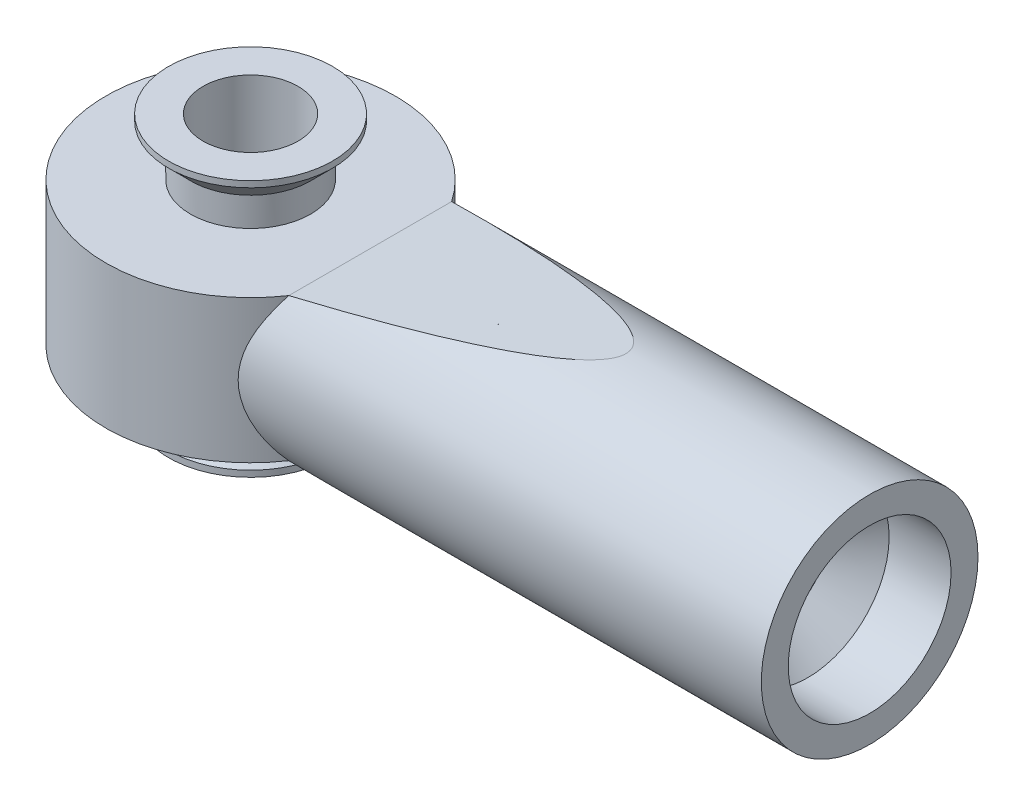
ISO-10303-21;
HEADER;
FILE_DESCRIPTION(('STEP AP214'),'2;1');
FILE_NAME('part.step','',(''),(''),'','','');
FILE_SCHEMA(('AUTOMOTIVE_DESIGN { 1 0 10303 214 1 1 1 1 }'));
ENDSEC;
DATA;
#1=APPLICATION_CONTEXT('core data for automotive mechanical design processes');
#2=APPLICATION_PROTOCOL_DEFINITION('international standard','automotive_design',2000,#1);
#3=PRODUCT_CONTEXT('',#1,'mechanical');
#4=PRODUCT('Part','Part','',(#3));
#5=PRODUCT_RELATED_PRODUCT_CATEGORY('part','',(#4));
#6=PRODUCT_DEFINITION_FORMATION('','',#4);
#7=PRODUCT_DEFINITION_CONTEXT('part definition',#1,'design');
#8=PRODUCT_DEFINITION('design','',#6,#7);
#9=PRODUCT_DEFINITION_SHAPE('','',#8);
#10=(LENGTH_UNIT() NAMED_UNIT(*) SI_UNIT(.MILLI.,.METRE.));
#11=(NAMED_UNIT(*) PLANE_ANGLE_UNIT() SI_UNIT($,.RADIAN.));
#12=(NAMED_UNIT(*) SI_UNIT($,.STERADIAN.) SOLID_ANGLE_UNIT());
#13=UNCERTAINTY_MEASURE_WITH_UNIT(LENGTH_MEASURE(1.E-05),#10,'distance_accuracy_value','');
#14=(GEOMETRIC_REPRESENTATION_CONTEXT(3) GLOBAL_UNCERTAINTY_ASSIGNED_CONTEXT((#13)) GLOBAL_UNIT_ASSIGNED_CONTEXT((#10,
#11,#12)) REPRESENTATION_CONTEXT('',''));
#15=CARTESIAN_POINT('',(0.,0.,0.));
#16=DIRECTION('',(0.,0.,1.));
#17=DIRECTION('',(1.,0.,0.));
#18=AXIS2_PLACEMENT_3D('',#15,#16,#17);
#19=CARTESIAN_POINT('',(17.,0.,0.));
#20=DIRECTION('',(-1.,0.,0.));
#21=DIRECTION('',(0.,0.,1.));
#22=AXIS2_PLACEMENT_3D('',#19,#20,#21);
#23=CYLINDRICAL_SURFACE('',#22,3.5);
#24=CARTESIAN_POINT('',(3.86545275485292,-2.31,2.62942959593901));
#25=CARTESIAN_POINT('',(3.82315125019685,-2.23916639045834,2.69163558248972));
#26=CARTESIAN_POINT('',(3.78060308197022,-2.16591923057143,2.75093631681326));
#27=CARTESIAN_POINT('',(3.69597081213414,-2.01458999035849,2.86362891555874));
#28=CARTESIAN_POINT('',(3.65388736125131,-1.93650194691396,2.91701325706475));
#29=CARTESIAN_POINT('',(3.57069852067631,-1.77458168341613,3.01829294269165));
#30=CARTESIAN_POINT('',(3.52961385522195,-1.69068640601002,3.06610494584605));
#31=CARTESIAN_POINT('',(3.45032221851786,-1.51820866561967,3.15506796810709));
#32=CARTESIAN_POINT('',(3.4121136698583,-1.42962881795746,3.19622265287118));
#33=CARTESIAN_POINT('',(3.32269979003703,-1.2041589793433,3.28956154879868));
#34=CARTESIAN_POINT('',(3.27404228373987,-1.06446261710354,3.33757830087836));
#35=CARTESIAN_POINT('',(3.19211369892511,-0.776372924365029,3.41603748196162));
#36=CARTESIAN_POINT('',(3.15876861079958,-0.62802541758275,3.44656462491423));
#37=CARTESIAN_POINT('',(3.12410092169717,-0.400213578668356,3.47790818529037));
#38=CARTESIAN_POINT('',(3.11509570930935,-0.322844145616872,3.48595240590558));
#39=CARTESIAN_POINT('',(3.1028388679205,-0.167268493420498,3.49686862876157));
#40=CARTESIAN_POINT('',(3.09958697231596,-0.0890623132186827,3.4997408706673));
#41=CARTESIAN_POINT('',(3.0990395309018,0.067370699419271,3.50022552023661));
#42=CARTESIAN_POINT('',(3.10174275105624,0.145597524218554,3.49783901763209));
#43=CARTESIAN_POINT('',(3.11293351633187,0.301281760312659,3.48788205501167));
#44=CARTESIAN_POINT('',(3.12142093600615,0.37873918825709,3.48031170742224));
#45=CARTESIAN_POINT('',(3.15149632426064,0.585480008125305,3.45316764108692));
#46=CARTESIAN_POINT('',(3.17808752206281,0.713453944491327,3.42891053279658));
#47=CARTESIAN_POINT('',(3.24330128453004,0.96336898615014,3.36728439780416));
#48=CARTESIAN_POINT('',(3.28196952599256,1.08528511633356,3.32986552278641));
#49=CARTESIAN_POINT('',(3.36261132369463,1.30806335110264,3.24828728457426));
#50=CARTESIAN_POINT('',(3.40368779105866,1.40973110527985,3.20540497245888));
#51=CARTESIAN_POINT('',(3.49011920634573,1.60723341644409,3.1110754628632));
#52=CARTESIAN_POINT('',(3.53547912891955,1.70306097303739,3.05961825245294));
#53=CARTESIAN_POINT('',(3.62800160636842,1.88761537461664,2.94929551352007));
#54=CARTESIAN_POINT('',(3.67513701943126,1.97641191102892,2.89052323000088));
#55=CARTESIAN_POINT('',(3.7701099515216,2.14780958330742,2.76551755553624));
#56=CARTESIAN_POINT('',(3.81794556868654,2.23042473545763,2.69930195243758));
#57=CARTESIAN_POINT('',(3.86545275485295,2.30999999999999,2.62942959593903));
#58=B_SPLINE_CURVE_WITH_KNOTS('',3,(#24,#25,#26,#27,#28,#29,#30,#31,#32,#33,#34,#35,#36,#37,#38,
#39,#40,#41,#42,#43,#44,#45,#46,#47,#48,#49,#50,#51,#52,#53,#54,#55,#56,#57),.UNSPECIFIED.,.F.,
.F.,(4,2,2,2,2,2,2,2,2,2,2,2,2,2,2,2,4),(0.,0.309920368521231,0.620230397415549,
0.934707669024716,1.24901118914877,1.7139549399129,2.17662718996787,2.41121044490835,
2.64578282918733,2.88030660928519,3.11482530322598,3.51197516996565,3.91064567498154,
4.26328664620656,4.61634232029633,4.96528677463775,5.31341438132882),.UNSPECIFIED.);
#59=CARTESIAN_POINT('',(3.86545275485292,-2.31,2.62942959593901));
#60=VERTEX_POINT('',#59);
#61=CARTESIAN_POINT('',(3.86545275485292,2.31,2.62942959593901));
#62=VERTEX_POINT('',#61);
#63=EDGE_CURVE('E77',#60,#62,#58,.T.);
#64=ORIENTED_EDGE('',*,*,#63,.F.);
#65=CARTESIAN_POINT('',(-12.1677860151385,0.,0.));
#66=DIRECTION('',(0.142603230781916,0.989779934414999,0.));
#67=DIRECTION('',(-0.989779934414999,0.142603230781916,0.));
#68=AXIS2_PLACEMENT_3D('',#65,#66,#67);
#69=ELLIPSE('',#68,24.5436234565581,3.5);
#70=CARTESIAN_POINT('',(3.86545275485292,-2.31,-2.62942959593902));
#71=VERTEX_POINT('',#70);
#72=EDGE_CURVE('E71',#60,#71,#69,.T.);
#73=ORIENTED_EDGE('',*,*,#72,.T.);
#74=CARTESIAN_POINT('',(3.86545275485292,2.31,-2.62942959593901));
#75=CARTESIAN_POINT('',(3.82315125019685,2.23916639045834,-2.69163558248972));
#76=CARTESIAN_POINT('',(3.78060308197022,2.16591923057143,-2.75093631681326));
#77=CARTESIAN_POINT('',(3.69597081213414,2.01458999035849,-2.86362891555874));
#78=CARTESIAN_POINT('',(3.65388736125131,1.93650194691396,-2.91701325706475));
#79=CARTESIAN_POINT('',(3.57069852067631,1.77458168341613,-3.01829294269165));
#80=CARTESIAN_POINT('',(3.52961385522195,1.69068640601002,-3.06610494584605));
#81=CARTESIAN_POINT('',(3.45032221851786,1.51820866561967,-3.15506796810709));
#82=CARTESIAN_POINT('',(3.4121136698583,1.42962881795746,-3.19622265287118));
#83=CARTESIAN_POINT('',(3.32269979003703,1.2041589793433,-3.28956154879868));
#84=CARTESIAN_POINT('',(3.27404228373987,1.06446261710354,-3.33757830087836));
#85=CARTESIAN_POINT('',(3.19211369892511,0.776372924365029,-3.41603748196162));
#86=CARTESIAN_POINT('',(3.15876861079958,0.62802541758275,-3.44656462491423));
#87=CARTESIAN_POINT('',(3.12410092169717,0.400213578668356,-3.47790818529037));
#88=CARTESIAN_POINT('',(3.11509570930935,0.322844145616872,-3.48595240590558));
#89=CARTESIAN_POINT('',(3.1028388679205,0.167268493420498,-3.49686862876157));
#90=CARTESIAN_POINT('',(3.09958697231596,0.0890623132186827,-3.4997408706673));
#91=CARTESIAN_POINT('',(3.0990395309018,-0.067370699419271,-3.50022552023661));
#92=CARTESIAN_POINT('',(3.10174275105624,-0.145597524218554,-3.49783901763209));
#93=CARTESIAN_POINT('',(3.11293351633187,-0.301281760312659,-3.48788205501167));
#94=CARTESIAN_POINT('',(3.12142093600615,-0.37873918825709,-3.48031170742224));
#95=CARTESIAN_POINT('',(3.15149632426064,-0.585480008125305,-3.45316764108692));
#96=CARTESIAN_POINT('',(3.17808752206281,-0.713453944491327,-3.42891053279658));
#97=CARTESIAN_POINT('',(3.24330128453004,-0.96336898615014,-3.36728439780416));
#98=CARTESIAN_POINT('',(3.28196952599256,-1.08528511633356,-3.32986552278641));
#99=CARTESIAN_POINT('',(3.36261132369463,-1.30806335110264,-3.24828728457426));
#100=CARTESIAN_POINT('',(3.40368779105866,-1.40973110527985,-3.20540497245888));
#101=CARTESIAN_POINT('',(3.49011920634573,-1.60723341644409,-3.1110754628632));
#102=CARTESIAN_POINT('',(3.53547912891955,-1.70306097303739,-3.05961825245294));
#103=CARTESIAN_POINT('',(3.62800160636842,-1.88761537461664,-2.94929551352007));
#104=CARTESIAN_POINT('',(3.67513701943126,-1.97641191102892,-2.89052323000088));
#105=CARTESIAN_POINT('',(3.7701099515216,-2.14780958330742,-2.76551755553624));
#106=CARTESIAN_POINT('',(3.81794556868654,-2.23042473545763,-2.69930195243758));
#107=CARTESIAN_POINT('',(3.86545275485295,-2.30999999999999,-2.62942959593903));
#108=B_SPLINE_CURVE_WITH_KNOTS('',3,(#74,#75,#76,#77,#78,#79,#80,#81,#82,#83,#84,#85,#86,#87,
#88,#89,#90,#91,#92,#93,#94,#95,#96,#97,#98,#99,#100,#101,#102,#103,#104,#105,#106,#107),
.UNSPECIFIED.,.F.,.F.,(4,2,2,2,2,2,2,2,2,2,2,2,2,2,2,2,4),(0.,0.309920368521231,
0.620230397415549,0.934707669024716,1.24901118914877,1.7139549399129,2.17662718996787,
2.41121044490835,2.64578282918733,2.88030660928519,3.11482530322598,3.51197516996565,
3.91064567498154,4.26328664620656,4.61634232029633,4.96528677463775,5.31341438132882),.UNSPECIFIED.);
#109=CARTESIAN_POINT('',(3.86545275485292,2.31,-2.62942959593901));
#110=VERTEX_POINT('',#109);
#111=EDGE_CURVE('E75',#110,#71,#108,.T.);
#112=ORIENTED_EDGE('',*,*,#111,.F.);
#113=CARTESIAN_POINT('',(-12.1677860151385,0.,0.));
#114=DIRECTION('',(-0.142603230781916,0.989779934414999,0.));
#115=DIRECTION('',(-0.989779934414999,-0.142603230781916,0.));
#116=AXIS2_PLACEMENT_3D('',#113,#114,#115);
#117=ELLIPSE('',#116,24.5436234565581,3.5);
#118=EDGE_CURVE('E55',#62,#110,#117,.T.);
#119=ORIENTED_EDGE('',*,*,#118,.F.);
#120=EDGE_LOOP('',(#64,#73,#112,#119));
#121=FACE_BOUND('',#120,.T.);
#122=CARTESIAN_POINT('',(20.,0.,0.));
#123=DIRECTION('',(1.,0.,0.));
#124=DIRECTION('',(0.,0.,-1.));
#125=AXIS2_PLACEMENT_3D('',#122,#123,#124);
#126=CIRCLE('',#125,3.5);
#127=CARTESIAN_POINT('',(20.,0.,-3.5));
#128=VERTEX_POINT('',#127);
#129=EDGE_CURVE('E86',#128,#128,#126,.T.);
#130=ORIENTED_EDGE('',*,*,#129,.F.);
#131=EDGE_LOOP('',(#130));
#132=FACE_BOUND('',#131,.T.);
#133=ADVANCED_FACE('F41',(#121,#132),#23,.T.);
#134=CARTESIAN_POINT('',(0.,-2.31,0.));
#135=DIRECTION('',(0.,1.,0.));
#136=DIRECTION('',(0.,0.,1.));
#137=AXIS2_PLACEMENT_3D('',#134,#135,#136);
#138=PLANE('',#137);
#139=CARTESIAN_POINT('',(0.,-2.31,0.));
#140=DIRECTION('',(0.,-1.,0.));
#141=DIRECTION('',(0.,0.,-1.));
#142=AXIS2_PLACEMENT_3D('',#139,#140,#141);
#143=CIRCLE('',#142,1.94);
#144=CARTESIAN_POINT('',(0.,-2.31,-1.94));
#145=VERTEX_POINT('',#144);
#146=EDGE_CURVE('E152',#145,#145,#143,.T.);
#147=ORIENTED_EDGE('',*,*,#146,.F.);
#148=EDGE_LOOP('',(#147));
#149=FACE_BOUND('',#148,.T.);
#150=CARTESIAN_POINT('',(0.,-2.31,0.));
#151=DIRECTION('',(0.,1.,0.));
#152=DIRECTION('',(0.,0.,1.));
#153=AXIS2_PLACEMENT_3D('',#150,#151,#152);
#154=CIRCLE('',#153,4.675);
#155=EDGE_CURVE('E90',#71,#60,#154,.T.);
#156=ORIENTED_EDGE('',*,*,#155,.F.);
#157=DIRECTION('',(0.,0.,-1.));
#158=VECTOR('',#157,1.);
#159=CARTESIAN_POINT('',(3.86545275485292,-2.31,35.1521253581698));
#160=LINE('',#159,#158);
#161=EDGE_CURVE('E80',#60,#71,#160,.T.);
#162=ORIENTED_EDGE('',*,*,#161,.F.);
#163=EDGE_LOOP('',(#156,#162));
#164=FACE_BOUND('',#163,.T.);
#165=ADVANCED_FACE('F93',(#149,#164),#138,.F.);
#166=CARTESIAN_POINT('',(0.,2.31,0.));
#167=DIRECTION('',(0.,1.,0.));
#168=DIRECTION('',(0.,0.,1.));
#169=AXIS2_PLACEMENT_3D('',#166,#167,#168);
#170=PLANE('',#169);
#171=CARTESIAN_POINT('',(0.,2.31,0.));
#172=DIRECTION('',(0.,1.,0.));
#173=DIRECTION('',(0.,0.,1.));
#174=AXIS2_PLACEMENT_3D('',#171,#172,#173);
#175=CIRCLE('',#174,1.94);
#176=CARTESIAN_POINT('',(0.,2.31,1.94));
#177=VERTEX_POINT('',#176);
#178=EDGE_CURVE('E129',#177,#177,#175,.T.);
#179=ORIENTED_EDGE('',*,*,#178,.F.);
#180=EDGE_LOOP('',(#179));
#181=FACE_BOUND('',#180,.T.);
#182=CARTESIAN_POINT('',(0.,2.31,0.));
#183=DIRECTION('',(0.,1.,0.));
#184=DIRECTION('',(0.,0.,1.));
#185=AXIS2_PLACEMENT_3D('',#182,#183,#184);
#186=CIRCLE('',#185,4.675);
#187=EDGE_CURVE('E62',#110,#62,#186,.T.);
#188=ORIENTED_EDGE('',*,*,#187,.T.);
#189=DIRECTION('',(0.,0.,-1.));
#190=VECTOR('',#189,1.);
#191=CARTESIAN_POINT('',(3.86545275485292,2.31,32.7771253581698));
#192=LINE('',#191,#190);
#193=EDGE_CURVE('E79',#62,#110,#192,.T.);
#194=ORIENTED_EDGE('',*,*,#193,.T.);
#195=EDGE_LOOP('',(#188,#194));
#196=FACE_BOUND('',#195,.T.);
#197=ADVANCED_FACE('F144',(#181,#196),#170,.T.);
#198=CARTESIAN_POINT('',(0.,2.31,0.));
#199=DIRECTION('',(0.,-1.,0.));
#200=DIRECTION('',(0.,0.,-1.));
#201=AXIS2_PLACEMENT_3D('',#198,#199,#200);
#202=CYLINDRICAL_SURFACE('',#201,4.675);
#203=ORIENTED_EDGE('',*,*,#187,.F.);
#204=ORIENTED_EDGE('',*,*,#111,.T.);
#205=ORIENTED_EDGE('',*,*,#155,.T.);
#206=ORIENTED_EDGE('',*,*,#63,.T.);
#207=EDGE_LOOP('',(#203,#204,#205,#206));
#208=FACE_BOUND('',#207,.T.);
#209=ADVANCED_FACE('F89',(#208),#202,.T.);
#210=CARTESIAN_POINT('',(3.86545275485292,2.31,32.7771253581698));
#211=DIRECTION('',(-0.142603230781916,0.989779934414999,0.));
#212=DIRECTION('',(-0.989779934414999,-0.142603230781916,0.));
#213=AXIS2_PLACEMENT_3D('',#210,#211,#212);
#214=PLANE('',#213);
#215=ORIENTED_EDGE('',*,*,#193,.F.);
#216=ORIENTED_EDGE('',*,*,#118,.T.);
#217=EDGE_LOOP('',(#215,#216));
#218=FACE_BOUND('',#217,.T.);
#219=ADVANCED_FACE('F184',(#218),#214,.T.);
#220=CARTESIAN_POINT('',(3.86545275485292,-2.31,35.1521253581698));
#221=DIRECTION('',(0.142603230781916,0.989779934414999,0.));
#222=DIRECTION('',(-0.989779934414999,0.142603230781916,0.));
#223=AXIS2_PLACEMENT_3D('',#220,#221,#222);
#224=PLANE('',#223);
#225=ORIENTED_EDGE('',*,*,#72,.F.);
#226=ORIENTED_EDGE('',*,*,#161,.T.);
#227=EDGE_LOOP('',(#225,#226));
#228=FACE_BOUND('',#227,.T.);
#229=ADVANCED_FACE('F83',(#228),#224,.F.);
#230=CARTESIAN_POINT('',(20.,0.,0.));
#231=DIRECTION('',(1.,0.,0.));
#232=DIRECTION('',(0.,0.,-1.));
#233=AXIS2_PLACEMENT_3D('',#230,#231,#232);
#234=PLANE('',#233);
#235=ORIENTED_EDGE('',*,*,#129,.T.);
#236=EDGE_LOOP('',(#235));
#237=FACE_BOUND('',#236,.T.);
#238=CARTESIAN_POINT('',(20.,0.,0.));
#239=DIRECTION('',(1.,0.,0.));
#240=DIRECTION('',(0.,0.,-1.));
#241=AXIS2_PLACEMENT_3D('',#238,#239,#240);
#242=CIRCLE('',#241,2.63);
#243=CARTESIAN_POINT('',(20.,0.,-2.63));
#244=VERTEX_POINT('',#243);
#245=EDGE_CURVE('E179',#244,#244,#242,.T.);
#246=ORIENTED_EDGE('',*,*,#245,.F.);
#247=EDGE_LOOP('',(#246));
#248=FACE_BOUND('',#247,.T.);
#249=ADVANCED_FACE('F191',(#237,#248),#234,.T.);
#250=CARTESIAN_POINT('',(20.,0.,0.));
#251=DIRECTION('',(-1.,0.,0.));
#252=DIRECTION('',(0.,0.,1.));
#253=AXIS2_PLACEMENT_3D('',#250,#251,#252);
#254=CYLINDRICAL_SURFACE('',#253,2.63);
#255=CARTESIAN_POINT('',(18.,0.,0.));
#256=DIRECTION('',(1.,0.,0.));
#257=DIRECTION('',(0.,0.,-1.));
#258=AXIS2_PLACEMENT_3D('',#255,#256,#257);
#259=CIRCLE('',#258,2.63);
#260=CARTESIAN_POINT('',(18.,0.,-2.63));
#261=VERTEX_POINT('',#260);
#262=EDGE_CURVE('E12',#261,#261,#259,.F.);
#263=ORIENTED_EDGE('',*,*,#262,.T.);
#264=EDGE_LOOP('',(#263));
#265=FACE_BOUND('',#264,.T.);
#266=ORIENTED_EDGE('',*,*,#245,.T.);
#267=EDGE_LOOP('',(#266));
#268=FACE_BOUND('',#267,.T.);
#269=ADVANCED_FACE('F117',(#265,#268),#254,.F.);
#270=CARTESIAN_POINT('',(4.39267856779892,0.,1.6));
#271=CARTESIAN_POINT('',(4.39267783068027,0.0869985683872898,1.60000091719905));
#272=CARTESIAN_POINT('',(4.39529134416636,0.173990829474555,1.59288037177048));
#273=CARTESIAN_POINT('',(4.40540493577367,0.345388620748124,1.56468910286211));
#274=CARTESIAN_POINT('',(4.41290560332278,0.429793837631407,1.54361669667704));
#275=CARTESIAN_POINT('',(4.43184653083318,0.593504893035541,1.48835621276796));
#276=CARTESIAN_POINT('',(4.44327872322318,0.672820782534057,1.45419497733885));
#277=CARTESIAN_POINT('',(4.46878259348331,0.824622677538631,1.37381900529423));
#278=CARTESIAN_POINT('',(4.48285490153016,0.89710704619087,1.32760138987668));
#279=CARTESIAN_POINT('',(4.51270466683595,1.03617996677286,1.22238127241968));
#280=CARTESIAN_POINT('',(4.52852626703914,1.10244568563931,1.16296448791584));
#281=CARTESIAN_POINT('',(4.55971983740334,1.22429393392608,1.03391574170305));
#282=CARTESIAN_POINT('',(4.57509173048807,1.27987464100909,0.964282041055312));
#283=CARTESIAN_POINT('',(4.60416775398041,1.38025819578965,0.814397001324495));
#284=CARTESIAN_POINT('',(4.61781395596332,1.42472019845003,0.733905152818253));
#285=CARTESIAN_POINT('',(4.64137880146701,1.4993438421169,0.566036957563993));
#286=CARTESIAN_POINT('',(4.65129850751435,1.52950956003027,0.478662581822227));
#287=CARTESIAN_POINT('',(4.66597987770425,1.57358196541378,0.302896342780723));
#288=CARTESIAN_POINT('',(4.67091669985343,1.58804225212001,0.214658197497899));
#289=CARTESIAN_POINT('',(4.67569921389321,1.60205634153264,0.0368790073134609));
#290=CARTESIAN_POINT('',(4.67554628756981,1.60161419001427,-0.0526616773710911));
#291=CARTESIAN_POINT('',(4.67028375291522,1.58618123278794,-0.22657570800873));
#292=CARTESIAN_POINT('',(4.66537920455921,1.57179229943517,-0.31100969683181));
#293=CARTESIAN_POINT('',(4.65142431547498,1.52987303226937,-0.476182891032238));
#294=CARTESIAN_POINT('',(4.64237369015265,1.5023417963398,-0.556921842357102));
#295=CARTESIAN_POINT('',(4.62088862619212,1.4345832665099,-0.713697118877403));
#296=CARTESIAN_POINT('',(4.60841017362769,1.39418966221873,-0.789655283573059));
#297=CARTESIAN_POINT('',(4.58136105638374,1.30199194469094,-0.933888955856146));
#298=CARTESIAN_POINT('',(4.56678978880269,1.25018454104439,-1.00216223942625));
#299=CARTESIAN_POINT('',(4.53623352034167,1.13362338687979,-1.13266268666825));
#300=CARTESIAN_POINT('',(4.52021424187374,1.06835602022471,-1.19442375060662));
#301=CARTESIAN_POINT('',(4.48916868049016,0.928261278909806,-1.30628002257966));
#302=CARTESIAN_POINT('',(4.47414256868552,0.853432263370069,-1.35637322411099));
#303=CARTESIAN_POINT('',(4.44659093585832,0.69478844099452,-1.44416503299335));
#304=CARTESIAN_POINT('',(4.43410851262751,0.610850701265377,-1.48165606468019));
#305=CARTESIAN_POINT('',(4.41355538544715,0.437317433934365,-1.54180942512934));
#306=CARTESIAN_POINT('',(4.40548271189674,0.347724452208705,-1.56447837502054));
#307=CARTESIAN_POINT('',(4.39511260307666,0.1699592204286,-1.5933725555286));
#308=CARTESIAN_POINT('',(4.39256026037587,0.0819199332680171,-1.60032428518256));
#309=CARTESIAN_POINT('',(4.39280529830769,-0.094085526328023,-1.59965258967879));
#310=CARTESIAN_POINT('',(4.39560163846549,-0.18205170965411,-1.59203199926236));
#311=CARTESIAN_POINT('',(4.4059738139099,-0.352026477148167,-1.56308615667784));
#312=CARTESIAN_POINT('',(4.41336950660047,-0.434135124119997,-1.542276901823));
#313=CARTESIAN_POINT('',(4.43190570175925,-0.593674929363688,-1.4881696816339));
#314=CARTESIAN_POINT('',(4.44304689038041,-0.67110522752103,-1.4548694278922));
#315=CARTESIAN_POINT('',(4.46827339283942,-0.821923753511974,-1.37547899426323));
#316=CARTESIAN_POINT('',(4.48244372251818,-0.895094302658536,-1.32900304693133));
#317=CARTESIAN_POINT('',(4.51197160385328,-1.03285981212858,-1.2250120144863));
#318=CARTESIAN_POINT('',(4.52732952267414,-1.09745210342149,-1.16749350715206));
#319=CARTESIAN_POINT('',(4.55845236038238,-1.21964557322925,-1.03955826411008));
#320=CARTESIAN_POINT('',(4.57419790642352,-1.27672004956065,-0.968632212966671));
#321=CARTESIAN_POINT('',(4.60355153674853,-1.37819705666087,-0.817821021592162));
#322=CARTESIAN_POINT('',(4.61715968394818,-1.42259996045739,-0.737936145188808));
#323=CARTESIAN_POINT('',(4.64065040294973,-1.4970828298551,-0.571816793678163));
#324=CARTESIAN_POINT('',(4.65055542217576,-1.5272493950314,-0.485624492750948));
#325=CARTESIAN_POINT('',(4.66561873453227,-1.57252493732879,-0.30898175823054));
#326=CARTESIAN_POINT('',(4.67077884473458,-1.58763967875823,-0.21853296862802));
#327=CARTESIAN_POINT('',(4.67562645910743,-1.60184186281183,-0.040749773189849));
#328=CARTESIAN_POINT('',(4.67557152395605,-1.60168360180697,0.0465179824872602));
#329=CARTESIAN_POINT('',(4.67063702881648,-1.58722127475392,0.219725681321724));
#330=CARTESIAN_POINT('',(4.66575789658315,-1.57291846288339,0.305665741517825));
#331=CARTESIAN_POINT('',(4.65182289039677,-1.53108089454722,0.472273941383296));
#332=CARTESIAN_POINT('',(4.64284160967053,-1.50378209633975,0.553008023649338));
#333=CARTESIAN_POINT('',(4.62162808681448,-1.43694889358252,0.70877692089733));
#334=CARTESIAN_POINT('',(4.60939524703786,-1.39741223945621,0.783810684879449));
#335=CARTESIAN_POINT('',(4.58235062932535,-1.30549262206962,0.92917376104059));
#336=CARTESIAN_POINT('',(4.56745824947838,-1.25267699893913,0.999214269764501));
#337=CARTESIAN_POINT('',(4.53695272745513,-1.13642308982909,1.12968233848246));
#338=CARTESIAN_POINT('',(4.52133935030963,-1.07298132289523,1.19010673570195));
#339=CARTESIAN_POINT('',(4.49036835758305,-0.9341018400152,1.3022075194427));
#340=CARTESIAN_POINT('',(4.47504885454638,-0.858272936301513,1.35341141391535));
#341=CARTESIAN_POINT('',(4.44719130801931,-0.698605196762074,1.44232292262097));
#342=CARTESIAN_POINT('',(4.43465272822222,-0.614767909838855,1.48003313999877));
#343=CARTESIAN_POINT('',(4.41424078240395,-0.443732167076276,1.53983175189985));
#344=CARTESIAN_POINT('',(4.40624981312198,-0.356687133344895,1.56231711274222));
#345=CARTESIAN_POINT('',(4.39547012061664,-0.179758393979245,1.5923978033088));
#346=CARTESIAN_POINT('',(4.39267932929595,-0.0898758312917925,1.59999905246686));
#347=CARTESIAN_POINT('',(4.39267856779892,0.,1.6));
#348=B_SPLINE_CURVE_WITH_KNOTS('',3,(#270,#271,#272,#273,#274,#275,#276,#277,#278,#279,#280,
#281,#282,#283,#284,#285,#286,#287,#288,#289,#290,#291,#292,#293,#294,#295,#296,#297,#298,#299,
#300,#301,#302,#303,#304,#305,#306,#307,#308,#309,#310,#311,#312,#313,#314,#315,#316,#317,#318,
#319,#320,#321,#322,#323,#324,#325,#326,#327,#328,#329,#330,#331,#332,#333,#334,#335,#336,#337,
#338,#339,#340,#341,#342,#343,#344,#345,#346,#347),.UNSPECIFIED.,.T.,.F.,(4,2,2,2,2,2,2,2,2,2,2,
2,2,2,2,2,2,2,2,2,2,2,2,2,2,2,2,2,2,2,2,2,2,2,2,2,2,2,4),(0.,0.260662497959913,
0.521356439616513,0.78151859268523,1.0417429237866,1.31172127606655,1.58174563260029,
1.85924287816688,2.13666094146959,2.40394667518876,2.67115984566227,2.92733237142009,
3.18352248395252,3.44316968787487,3.70289184197402,3.97546071177985,4.24807642026101,
4.52498454936069,4.80176889697574,5.06547241368911,5.32912463759504,5.58304959089019,
5.8370210871234,6.09937277615357,6.3618059027372,6.63766465469353,6.91351528503915,
7.1876655707418,7.46171082630113,7.72222893272045,7.98272394143288,8.23865992723801,
8.49464298745383,8.7603948149393,9.02623386933799,9.30320905327587,9.58013077545339,
9.84952120088046,10.1188044675482),.UNSPECIFIED.);
#349=CARTESIAN_POINT('',(4.39267856779892,0.,1.6));
#350=VERTEX_POINT('',#349);
#351=EDGE_CURVE('E95',#350,#350,#348,.T.);
#352=ORIENTED_EDGE('',*,*,#351,.F.);
#353=EDGE_LOOP('',(#352));
#354=FACE_BOUND('',#353,.T.);
#355=ADVANCED_FACE('F111',(#354),#202,.T.);
#356=CARTESIAN_POINT('',(17.,0.,0.));
#357=DIRECTION('',(-1.,0.,0.));
#358=DIRECTION('',(0.,0.,1.));
#359=AXIS2_PLACEMENT_3D('',#356,#357,#358);
#360=CYLINDRICAL_SURFACE('',#359,1.6);
#361=CARTESIAN_POINT('',(17.,0.,0.));
#362=DIRECTION('',(1.,0.,0.));
#363=DIRECTION('',(0.,0.,-1.));
#364=AXIS2_PLACEMENT_3D('',#361,#362,#363);
#365=CIRCLE('',#364,1.6);
#366=CARTESIAN_POINT('',(17.,0.,-1.6));
#367=VERTEX_POINT('',#366);
#368=EDGE_CURVE('E91',#367,#367,#365,.T.);
#369=ORIENTED_EDGE('',*,*,#368,.T.);
#370=EDGE_LOOP('',(#369));
#371=FACE_BOUND('',#370,.T.);
#372=ORIENTED_EDGE('',*,*,#351,.T.);
#373=EDGE_LOOP('',(#372));
#374=FACE_BOUND('',#373,.T.);
#375=ADVANCED_FACE('F116',(#371,#374),#360,.F.);
#376=CARTESIAN_POINT('',(17.,0.,0.));
#377=DIRECTION('',(1.,0.,0.));
#378=DIRECTION('',(0.,0.,-1.));
#379=AXIS2_PLACEMENT_3D('',#376,#377,#378);
#380=PLANE('',#379);
#381=CARTESIAN_POINT('',(17.,0.,0.));
#382=DIRECTION('',(1.,0.,0.));
#383=DIRECTION('',(0.,0.,-1.));
#384=AXIS2_PLACEMENT_3D('',#381,#382,#383);
#385=CIRCLE('',#384,1.63);
#386=CARTESIAN_POINT('',(17.,0.,-1.63));
#387=VERTEX_POINT('',#386);
#388=EDGE_CURVE('E49',#387,#387,#385,.T.);
#389=ORIENTED_EDGE('',*,*,#388,.T.);
#390=EDGE_LOOP('',(#389));
#391=FACE_BOUND('',#390,.T.);
#392=ORIENTED_EDGE('',*,*,#368,.F.);
#393=EDGE_LOOP('',(#392));
#394=FACE_BOUND('',#393,.T.);
#395=ADVANCED_FACE('F120',(#391,#394),#380,.T.);
#396=CARTESIAN_POINT('',(0.,4.15,0.));
#397=DIRECTION('',(0.,1.,0.));
#398=DIRECTION('',(0.,0.,1.));
#399=AXIS2_PLACEMENT_3D('',#396,#397,#398);
#400=PLANE('',#399);
#401=CARTESIAN_POINT('',(0.,4.15,0.));
#402=DIRECTION('',(0.,1.,0.));
#403=DIRECTION('',(0.,0.,1.));
#404=AXIS2_PLACEMENT_3D('',#401,#402,#403);
#405=CIRCLE('',#404,1.535);
#406=CARTESIAN_POINT('',(0.,4.15,1.535));
#407=VERTEX_POINT('',#406);
#408=EDGE_CURVE('E161',#407,#407,#405,.T.);
#409=ORIENTED_EDGE('',*,*,#408,.F.);
#410=EDGE_LOOP('',(#409));
#411=FACE_BOUND('',#410,.T.);
#412=CARTESIAN_POINT('',(0.,4.15,0.));
#413=DIRECTION('',(0.,-1.,0.));
#414=DIRECTION('',(0.,0.,-1.));
#415=AXIS2_PLACEMENT_3D('',#412,#413,#414);
#416=CIRCLE('',#415,2.65);
#417=CARTESIAN_POINT('',(0.,4.15,-2.65));
#418=VERTEX_POINT('',#417);
#419=EDGE_CURVE('E176',#418,#418,#416,.T.);
#420=ORIENTED_EDGE('',*,*,#419,.F.);
#421=EDGE_LOOP('',(#420));
#422=FACE_BOUND('',#421,.T.);
#423=ADVANCED_FACE('F136',(#411,#422),#400,.T.);
#424=CARTESIAN_POINT('',(0.,2.31,0.));
#425=DIRECTION('',(0.,-1.,0.));
#426=DIRECTION('',(0.,0.,-1.));
#427=AXIS2_PLACEMENT_3D('',#424,#425,#426);
#428=CYLINDRICAL_SURFACE('',#427,2.65);
#429=ORIENTED_EDGE('',*,*,#419,.T.);
#430=EDGE_LOOP('',(#429));
#431=FACE_BOUND('',#430,.T.);
#432=CARTESIAN_POINT('',(0.,3.95,0.));
#433=DIRECTION('',(0.,-1.,0.));
#434=DIRECTION('',(0.,0.,-1.));
#435=AXIS2_PLACEMENT_3D('',#432,#433,#434);
#436=CIRCLE('',#435,2.65);
#437=CARTESIAN_POINT('',(0.,3.95,-2.65));
#438=VERTEX_POINT('',#437);
#439=EDGE_CURVE('E173',#438,#438,#436,.T.);
#440=ORIENTED_EDGE('',*,*,#439,.F.);
#441=EDGE_LOOP('',(#440));
#442=FACE_BOUND('',#441,.T.);
#443=ADVANCED_FACE('F202',(#431,#442),#428,.T.);
#444=CARTESIAN_POINT('',(0.,3.24,0.));
#445=DIRECTION('',(0.,1.,0.));
#446=DIRECTION('',(0.,0.,1.));
#447=AXIS2_PLACEMENT_3D('',#444,#445,#446);
#448=CONICAL_SURFACE('',#447,1.94,0.78539816339745);
#449=ORIENTED_EDGE('',*,*,#439,.T.);
#450=EDGE_LOOP('',(#449));
#451=FACE_BOUND('',#450,.T.);
#452=CARTESIAN_POINT('',(0.,3.24,0.));
#453=DIRECTION('',(0.,-1.,0.));
#454=DIRECTION('',(0.,0.,-1.));
#455=AXIS2_PLACEMENT_3D('',#452,#453,#454);
#456=CIRCLE('',#455,1.94);
#457=CARTESIAN_POINT('',(0.,3.24,-1.94));
#458=VERTEX_POINT('',#457);
#459=EDGE_CURVE('E170',#458,#458,#456,.T.);
#460=ORIENTED_EDGE('',*,*,#459,.F.);
#461=EDGE_LOOP('',(#460));
#462=FACE_BOUND('',#461,.T.);
#463=ADVANCED_FACE('F206',(#451,#462),#448,.T.);
#464=CARTESIAN_POINT('',(0.,2.31,0.));
#465=DIRECTION('',(0.,-1.,0.));
#466=DIRECTION('',(0.,0.,-1.));
#467=AXIS2_PLACEMENT_3D('',#464,#465,#466);
#468=CYLINDRICAL_SURFACE('',#467,1.94);
#469=ORIENTED_EDGE('',*,*,#459,.T.);
#470=EDGE_LOOP('',(#469));
#471=FACE_BOUND('',#470,.T.);
#472=ORIENTED_EDGE('',*,*,#178,.T.);
#473=EDGE_LOOP('',(#472));
#474=FACE_BOUND('',#473,.T.);
#475=ADVANCED_FACE('F210',(#471,#474),#468,.T.);
#476=CARTESIAN_POINT('',(0.,-4.15,0.));
#477=DIRECTION('',(0.,-1.,0.));
#478=DIRECTION('',(0.,0.,1.));
#479=AXIS2_PLACEMENT_3D('',#476,#477,#478);
#480=PLANE('',#479);
#481=CARTESIAN_POINT('',(0.,-4.15,0.));
#482=DIRECTION('',(0.,1.,0.));
#483=DIRECTION('',(0.,0.,1.));
#484=AXIS2_PLACEMENT_3D('',#481,#482,#483);
#485=CIRCLE('',#484,1.535);
#486=CARTESIAN_POINT('',(0.,-4.15,1.535));
#487=VERTEX_POINT('',#486);
#488=EDGE_CURVE('E155',#487,#487,#485,.T.);
#489=ORIENTED_EDGE('',*,*,#488,.T.);
#490=EDGE_LOOP('',(#489));
#491=FACE_BOUND('',#490,.T.);
#492=CARTESIAN_POINT('',(0.,-4.15,0.));
#493=DIRECTION('',(0.,-1.,0.));
#494=DIRECTION('',(0.,0.,-1.));
#495=AXIS2_PLACEMENT_3D('',#492,#493,#494);
#496=CIRCLE('',#495,2.65);
#497=CARTESIAN_POINT('',(0.,-4.15,-2.65));
#498=VERTEX_POINT('',#497);
#499=EDGE_CURVE('E167',#498,#498,#496,.T.);
#500=ORIENTED_EDGE('',*,*,#499,.T.);
#501=EDGE_LOOP('',(#500));
#502=FACE_BOUND('',#501,.T.);
#503=ADVANCED_FACE('F214',(#491,#502),#480,.T.);
#504=CARTESIAN_POINT('',(0.,-2.31,0.));
#505=DIRECTION('',(0.,1.,0.));
#506=DIRECTION('',(0.,0.,-1.));
#507=AXIS2_PLACEMENT_3D('',#504,#505,#506);
#508=CYLINDRICAL_SURFACE('',#507,2.65);
#509=ORIENTED_EDGE('',*,*,#499,.F.);
#510=EDGE_LOOP('',(#509));
#511=FACE_BOUND('',#510,.T.);
#512=CARTESIAN_POINT('',(0.,-3.95,0.));
#513=DIRECTION('',(0.,-1.,0.));
#514=DIRECTION('',(0.,0.,-1.));
#515=AXIS2_PLACEMENT_3D('',#512,#513,#514);
#516=CIRCLE('',#515,2.65);
#517=CARTESIAN_POINT('',(0.,-3.95,-2.65));
#518=VERTEX_POINT('',#517);
#519=EDGE_CURVE('E158',#518,#518,#516,.T.);
#520=ORIENTED_EDGE('',*,*,#519,.T.);
#521=EDGE_LOOP('',(#520));
#522=FACE_BOUND('',#521,.T.);
#523=ADVANCED_FACE('F218',(#511,#522),#508,.T.);
#524=CARTESIAN_POINT('',(0.,-3.24,0.));
#525=DIRECTION('',(0.,-1.,0.));
#526=DIRECTION('',(0.,0.,1.));
#527=AXIS2_PLACEMENT_3D('',#524,#525,#526);
#528=CONICAL_SURFACE('',#527,1.94,0.78539816339745);
#529=ORIENTED_EDGE('',*,*,#519,.F.);
#530=EDGE_LOOP('',(#529));
#531=FACE_BOUND('',#530,.T.);
#532=CARTESIAN_POINT('',(0.,-3.24,0.));
#533=DIRECTION('',(0.,-1.,0.));
#534=DIRECTION('',(0.,0.,-1.));
#535=AXIS2_PLACEMENT_3D('',#532,#533,#534);
#536=CIRCLE('',#535,1.94);
#537=CARTESIAN_POINT('',(0.,-3.24,-1.94));
#538=VERTEX_POINT('',#537);
#539=EDGE_CURVE('E154',#538,#538,#536,.T.);
#540=ORIENTED_EDGE('',*,*,#539,.T.);
#541=EDGE_LOOP('',(#540));
#542=FACE_BOUND('',#541,.T.);
#543=ADVANCED_FACE('F222',(#531,#542),#528,.T.);
#544=CARTESIAN_POINT('',(0.,-2.31,0.));
#545=DIRECTION('',(0.,1.,0.));
#546=DIRECTION('',(0.,0.,-1.));
#547=AXIS2_PLACEMENT_3D('',#544,#545,#546);
#548=CYLINDRICAL_SURFACE('',#547,1.94);
#549=ORIENTED_EDGE('',*,*,#539,.F.);
#550=EDGE_LOOP('',(#549));
#551=FACE_BOUND('',#550,.T.);
#552=ORIENTED_EDGE('',*,*,#146,.T.);
#553=EDGE_LOOP('',(#552));
#554=FACE_BOUND('',#553,.T.);
#555=ADVANCED_FACE('F226',(#551,#554),#548,.T.);
#556=CARTESIAN_POINT('',(0.,-4.15,0.));
#557=DIRECTION('',(0.,1.,0.));
#558=DIRECTION('',(0.,0.,1.));
#559=AXIS2_PLACEMENT_3D('',#556,#557,#558);
#560=CYLINDRICAL_SURFACE('',#559,1.535);
#561=CARTESIAN_POINT('',(0.,-4.15,1.535));
#562=CARTESIAN_POINT('',(0.,-4.06354166666667,1.535));
#563=CARTESIAN_POINT('',(0.,-3.97708333333333,1.535));
#564=CARTESIAN_POINT('',(0.,-3.80416666666667,1.535));
#565=CARTESIAN_POINT('',(0.,-3.71770833333333,1.535));
#566=CARTESIAN_POINT('',(0.,-3.54479166666667,1.535));
#567=CARTESIAN_POINT('',(0.,-3.45833333333333,1.535));
#568=CARTESIAN_POINT('',(0.,-3.28541666666667,1.535));
#569=CARTESIAN_POINT('',(0.,-3.19895833333333,1.535));
#570=CARTESIAN_POINT('',(0.,-3.02604166666667,1.535));
#571=CARTESIAN_POINT('',(0.,-2.93958333333333,1.535));
#572=CARTESIAN_POINT('',(0.,-2.76666666666667,1.535));
#573=CARTESIAN_POINT('',(0.,-2.68020833333333,1.535));
#574=CARTESIAN_POINT('',(0.,-2.50729166666667,1.535));
#575=CARTESIAN_POINT('',(0.,-2.42083333333333,1.535));
#576=CARTESIAN_POINT('',(0.,-2.24791666666667,1.535));
#577=CARTESIAN_POINT('',(0.,-2.16145833333333,1.535));
#578=CARTESIAN_POINT('',(0.,-1.98854166666667,1.535));
#579=CARTESIAN_POINT('',(0.,-1.90208333333333,1.535));
#580=CARTESIAN_POINT('',(0.,-1.72916666666667,1.535));
#581=CARTESIAN_POINT('',(0.,-1.64270833333333,1.535));
#582=CARTESIAN_POINT('',(0.,-1.46979166666667,1.535));
#583=CARTESIAN_POINT('',(0.,-1.38333333333333,1.535));
#584=CARTESIAN_POINT('',(0.,-1.21041666666667,1.535));
#585=CARTESIAN_POINT('',(0.,-1.12395833333333,1.535));
#586=CARTESIAN_POINT('',(0.,-0.951041666666667,1.535));
#587=CARTESIAN_POINT('',(0.,-0.864583333333333,1.535));
#588=CARTESIAN_POINT('',(0.,-0.691666666666667,1.535));
#589=CARTESIAN_POINT('',(0.,-0.605208333333333,1.535));
#590=CARTESIAN_POINT('',(0.,-0.432291666666667,1.535));
#591=CARTESIAN_POINT('',(0.,-0.345833333333333,1.535));
#592=CARTESIAN_POINT('',(0.,-0.172916666666667,1.535));
#593=CARTESIAN_POINT('',(0.,-0.0864583333333339,1.535));
#594=CARTESIAN_POINT('',(0.,0.0864583333333325,1.535));
#595=CARTESIAN_POINT('',(0.,0.172916666666666,1.535));
#596=CARTESIAN_POINT('',(0.,0.345833333333333,1.535));
#597=CARTESIAN_POINT('',(0.,0.432291666666666,1.535));
#598=CARTESIAN_POINT('',(0.,0.605208333333333,1.535));
#599=CARTESIAN_POINT('',(0.,0.691666666666666,1.535));
#600=CARTESIAN_POINT('',(0.,0.864583333333333,1.535));
#601=CARTESIAN_POINT('',(0.,0.951041666666666,1.535));
#602=CARTESIAN_POINT('',(0.,1.12395833333333,1.535));
#603=CARTESIAN_POINT('',(0.,1.21041666666667,1.535));
#604=CARTESIAN_POINT('',(0.,1.38333333333333,1.535));
#605=CARTESIAN_POINT('',(0.,1.46979166666667,1.535));
#606=CARTESIAN_POINT('',(0.,1.64270833333333,1.535));
#607=CARTESIAN_POINT('',(0.,1.72916666666667,1.535));
#608=CARTESIAN_POINT('',(0.,1.90208333333333,1.535));
#609=CARTESIAN_POINT('',(0.,1.98854166666667,1.535));
#610=CARTESIAN_POINT('',(0.,2.16145833333333,1.535));
#611=CARTESIAN_POINT('',(0.,2.24791666666667,1.535));
#612=CARTESIAN_POINT('',(0.,2.42083333333333,1.535));
#613=CARTESIAN_POINT('',(0.,2.50729166666667,1.535));
#614=CARTESIAN_POINT('',(0.,2.68020833333333,1.535));
#615=CARTESIAN_POINT('',(0.,2.76666666666667,1.535));
#616=CARTESIAN_POINT('',(0.,2.93958333333333,1.535));
#617=CARTESIAN_POINT('',(0.,3.02604166666667,1.535));
#618=CARTESIAN_POINT('',(0.,3.19895833333333,1.535));
#619=CARTESIAN_POINT('',(0.,3.28541666666667,1.535));
#620=CARTESIAN_POINT('',(0.,3.45833333333333,1.535));
#621=CARTESIAN_POINT('',(0.,3.54479166666667,1.535));
#622=CARTESIAN_POINT('',(0.,3.71770833333333,1.535));
#623=CARTESIAN_POINT('',(0.,3.80416666666667,1.535));
#624=CARTESIAN_POINT('',(0.,3.97708333333333,1.535));
#625=CARTESIAN_POINT('',(0.,4.06354166666667,1.535));
#626=CARTESIAN_POINT('',(0.,4.15,1.535));
#627=B_SPLINE_CURVE_WITH_KNOTS('',3,(#561,#562,#563,#564,#565,#566,#567,#568,#569,#570,#571,
#572,#573,#574,#575,#576,#577,#578,#579,#580,#581,#582,#583,#584,#585,#586,#587,#588,#589,#590,
#591,#592,#593,#594,#595,#596,#597,#598,#599,#600,#601,#602,#603,#604,#605,#606,#607,#608,#609,
#610,#611,#612,#613,#614,#615,#616,#617,#618,#619,#620,#621,#622,#623,#624,#625,#626),
.UNSPECIFIED.,.F.,.F.,(4,2,2,2,2,2,2,2,2,2,2,2,2,2,2,2,2,2,2,2,2,2,2,2,2,2,2,2,2,2,2,2,4),(0.,
0.259375,0.518750000000001,0.778125000000001,1.0375,1.296875,1.55625,1.815625,2.075,2.334375,
2.59375,2.853125,3.1125,3.371875,3.63125,3.890625,4.15,4.409375,4.66875,4.928125,5.1875,
5.446875,5.70625,5.965625,6.225,6.484375,6.74375,7.003125,7.2625,7.521875,7.78125,8.040625,8.3),.UNSPECIFIED.);
#628=EDGE_CURVE('BSEAM230',#487,#407,#627,.T.);
#629=ORIENTED_EDGE('',*,*,#488,.F.);
#630=ORIENTED_EDGE('',*,*,#408,.T.);
#631=ORIENTED_EDGE('',*,*,#628,.T.);
#632=ORIENTED_EDGE('',*,*,#628,.F.);
#633=EDGE_LOOP('',(#629,#631,#630,#632));
#634=FACE_BOUND('',#633,.T.);
#635=ADVANCED_FACE('F230',(#634),#560,.F.);
#636=CARTESIAN_POINT('',(17.,0.,0.));
#637=DIRECTION('',(1.,0.,0.));
#638=DIRECTION('',(0.,0.,-1.));
#639=AXIS2_PLACEMENT_3D('',#636,#637,#638);
#640=CONICAL_SURFACE('',#639,1.63,0.785398163397453);
#641=ORIENTED_EDGE('',*,*,#262,.F.);
#642=EDGE_LOOP('',(#641));
#643=FACE_BOUND('',#642,.T.);
#644=ORIENTED_EDGE('',*,*,#388,.F.);
#645=EDGE_LOOP('',(#644));
#646=FACE_BOUND('',#645,.T.);
#647=ADVANCED_FACE('F43',(#643,#646),#640,.F.);
#648=CLOSED_SHELL('',(#133,#165,#197,#209,#219,#229,#249,#269,#355,#375,#395,#423,#443,#463,
#475,#503,#523,#543,#555,#635,#647));
#649=MANIFOLD_SOLID_BREP('B2',#648);
#650=ADVANCED_BREP_SHAPE_REPRESENTATION('',(#18,#649),#14);
#651=SHAPE_DEFINITION_REPRESENTATION(#9,#650);
ENDSEC;
END-ISO-10303-21;
